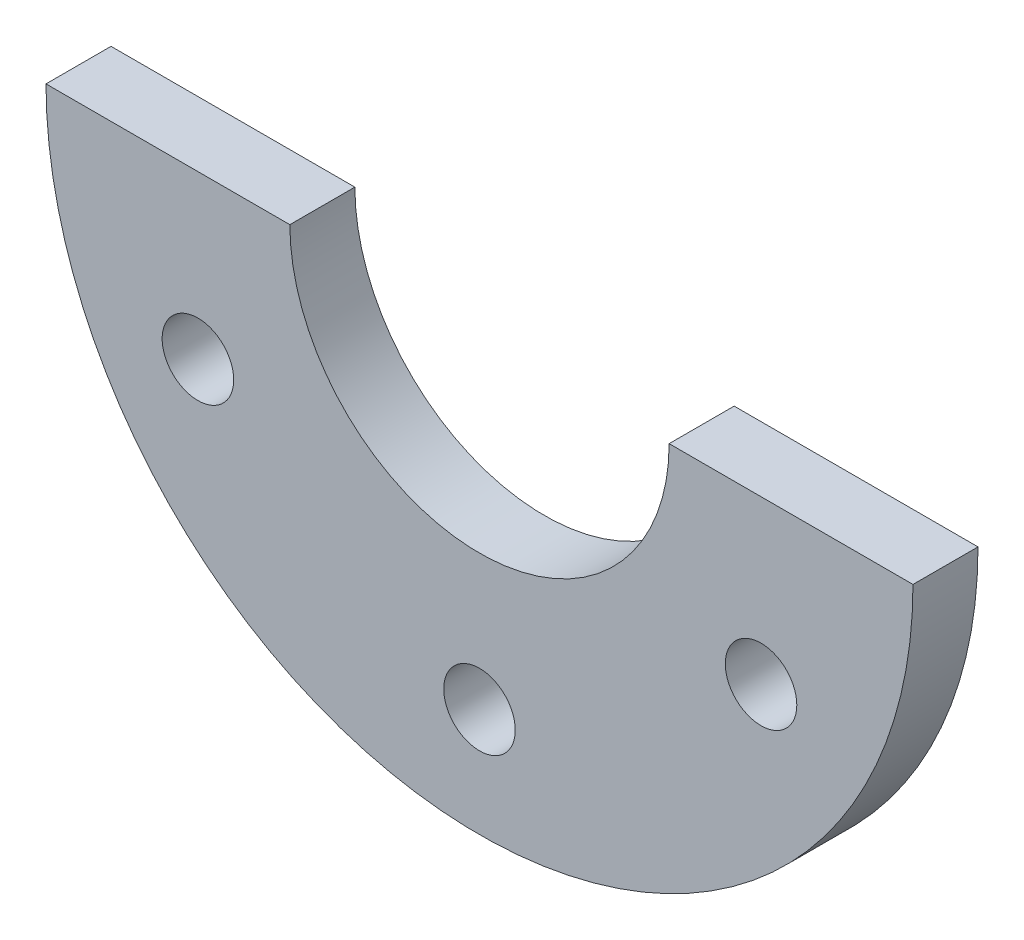
ISO-10303-21;
HEADER;
FILE_DESCRIPTION(('STEP AP214'),'2;1');
FILE_NAME('part.step','',(''),(''),'','','');
FILE_SCHEMA(('AUTOMOTIVE_DESIGN { 1 0 10303 214 1 1 1 1 }'));
ENDSEC;
DATA;
#1=APPLICATION_CONTEXT('core data for automotive mechanical design processes');
#2=APPLICATION_PROTOCOL_DEFINITION('international standard','automotive_design',2000,#1);
#3=PRODUCT_CONTEXT('',#1,'mechanical');
#4=PRODUCT('Part','Part','',(#3));
#5=PRODUCT_RELATED_PRODUCT_CATEGORY('part','',(#4));
#6=PRODUCT_DEFINITION_FORMATION('','',#4);
#7=PRODUCT_DEFINITION_CONTEXT('part definition',#1,'design');
#8=PRODUCT_DEFINITION('design','',#6,#7);
#9=PRODUCT_DEFINITION_SHAPE('','',#8);
#10=(LENGTH_UNIT() NAMED_UNIT(*) SI_UNIT(.MILLI.,.METRE.));
#11=(NAMED_UNIT(*) PLANE_ANGLE_UNIT() SI_UNIT($,.RADIAN.));
#12=(NAMED_UNIT(*) SI_UNIT($,.STERADIAN.) SOLID_ANGLE_UNIT());
#13=UNCERTAINTY_MEASURE_WITH_UNIT(LENGTH_MEASURE(1.E-05),#10,'distance_accuracy_value','');
#14=(GEOMETRIC_REPRESENTATION_CONTEXT(3) GLOBAL_UNCERTAINTY_ASSIGNED_CONTEXT((#13)) GLOBAL_UNIT_ASSIGNED_CONTEXT((#10,
#11,#12)) REPRESENTATION_CONTEXT('',''));
#15=CARTESIAN_POINT('',(0.,0.,0.));
#16=DIRECTION('',(0.,0.,1.));
#17=DIRECTION('',(1.,0.,0.));
#18=AXIS2_PLACEMENT_3D('',#15,#16,#17);
#19=CARTESIAN_POINT('',(0.,0.,6.));
#20=DIRECTION('',(0.,0.,-1.));
#21=DIRECTION('',(-1.,0.,0.));
#22=AXIS2_PLACEMENT_3D('',#19,#20,#21);
#23=CYLINDRICAL_SURFACE('',#22,40.);
#24=CARTESIAN_POINT('',(0.,0.,0.));
#25=DIRECTION('',(0.,0.,1.));
#26=DIRECTION('',(1.,0.,0.));
#27=AXIS2_PLACEMENT_3D('',#24,#25,#26);
#28=CIRCLE('',#27,40.);
#29=CARTESIAN_POINT('',(-40.,0.,0.));
#30=VERTEX_POINT('',#29);
#31=CARTESIAN_POINT('',(40.,0.,0.));
#32=VERTEX_POINT('',#31);
#33=EDGE_CURVE('E96',#30,#32,#28,.T.);
#34=ORIENTED_EDGE('',*,*,#33,.T.);
#35=DIRECTION('',(0.,0.,-1.));
#36=VECTOR('',#35,1.);
#37=CARTESIAN_POINT('',(40.,0.,6.));
#38=LINE('',#37,#36);
#39=CARTESIAN_POINT('',(40.,0.,6.));
#40=VERTEX_POINT('',#39);
#41=EDGE_CURVE('E11',#40,#32,#38,.T.);
#42=ORIENTED_EDGE('',*,*,#41,.F.);
#43=CARTESIAN_POINT('',(0.,0.,6.));
#44=DIRECTION('',(0.,0.,1.));
#45=DIRECTION('',(1.,0.,0.));
#46=AXIS2_PLACEMENT_3D('',#43,#44,#45);
#47=CIRCLE('',#46,40.);
#48=CARTESIAN_POINT('',(-40.,0.,6.));
#49=VERTEX_POINT('',#48);
#50=EDGE_CURVE('E84',#49,#40,#47,.T.);
#51=ORIENTED_EDGE('',*,*,#50,.F.);
#52=DIRECTION('',(0.,0.,-1.));
#53=VECTOR('',#52,1.);
#54=CARTESIAN_POINT('',(-40.,0.,6.));
#55=LINE('',#54,#53);
#56=EDGE_CURVE('E92',#49,#30,#55,.T.);
#57=ORIENTED_EDGE('',*,*,#56,.T.);
#58=EDGE_LOOP('',(#34,#42,#51,#57));
#59=FACE_BOUND('',#58,.T.);
#60=ADVANCED_FACE('F33',(#59),#23,.T.);
#61=CARTESIAN_POINT('',(17.5,0.,6.));
#62=DIRECTION('',(0.,-1.,0.));
#63=DIRECTION('',(1.,0.,0.));
#64=AXIS2_PLACEMENT_3D('',#61,#62,#63);
#65=PLANE('',#64);
#66=DIRECTION('',(-1.,0.,0.));
#67=VECTOR('',#66,1.);
#68=CARTESIAN_POINT('',(17.5,0.,0.));
#69=LINE('',#68,#67);
#70=CARTESIAN_POINT('',(17.5,0.,0.));
#71=VERTEX_POINT('',#70);
#72=EDGE_CURVE('E88',#32,#71,#69,.T.);
#73=ORIENTED_EDGE('',*,*,#72,.T.);
#74=DIRECTION('',(0.,0.,-1.));
#75=VECTOR('',#74,1.);
#76=CARTESIAN_POINT('',(17.5,0.,6.));
#77=LINE('',#76,#75);
#78=CARTESIAN_POINT('',(17.5,0.,6.));
#79=VERTEX_POINT('',#78);
#80=EDGE_CURVE('E41',#79,#71,#77,.T.);
#81=ORIENTED_EDGE('',*,*,#80,.F.);
#82=DIRECTION('',(-1.,0.,0.));
#83=VECTOR('',#82,1.);
#84=CARTESIAN_POINT('',(17.5,0.,6.));
#85=LINE('',#84,#83);
#86=EDGE_CURVE('E79',#40,#79,#85,.T.);
#87=ORIENTED_EDGE('',*,*,#86,.F.);
#88=ORIENTED_EDGE('',*,*,#41,.T.);
#89=EDGE_LOOP('',(#73,#81,#87,#88));
#90=FACE_BOUND('',#89,.T.);
#91=ADVANCED_FACE('F87',(#90),#65,.F.);
#92=CARTESIAN_POINT('',(0.,0.,6.));
#93=DIRECTION('',(0.,0.,-1.));
#94=DIRECTION('',(-1.,0.,0.));
#95=AXIS2_PLACEMENT_3D('',#92,#93,#94);
#96=CYLINDRICAL_SURFACE('',#95,17.5);
#97=CARTESIAN_POINT('',(0.,0.,0.));
#98=DIRECTION('',(0.,0.,-1.));
#99=DIRECTION('',(1.,0.,0.));
#100=AXIS2_PLACEMENT_3D('',#97,#98,#99);
#101=CIRCLE('',#100,17.5);
#102=CARTESIAN_POINT('',(-17.5,0.,0.));
#103=VERTEX_POINT('',#102);
#104=EDGE_CURVE('E66',#71,#103,#101,.T.);
#105=ORIENTED_EDGE('',*,*,#104,.T.);
#106=DIRECTION('',(0.,0.,-1.));
#107=VECTOR('',#106,1.);
#108=CARTESIAN_POINT('',(-17.5,0.,6.));
#109=LINE('',#108,#107);
#110=CARTESIAN_POINT('',(-17.5,0.,6.));
#111=VERTEX_POINT('',#110);
#112=EDGE_CURVE('E89',#111,#103,#109,.T.);
#113=ORIENTED_EDGE('',*,*,#112,.F.);
#114=CARTESIAN_POINT('',(0.,0.,6.));
#115=DIRECTION('',(0.,0.,-1.));
#116=DIRECTION('',(1.,0.,0.));
#117=AXIS2_PLACEMENT_3D('',#114,#115,#116);
#118=CIRCLE('',#117,17.5);
#119=EDGE_CURVE('E82',#79,#111,#118,.T.);
#120=ORIENTED_EDGE('',*,*,#119,.F.);
#121=ORIENTED_EDGE('',*,*,#80,.T.);
#122=EDGE_LOOP('',(#105,#113,#120,#121));
#123=FACE_BOUND('',#122,.T.);
#124=ADVANCED_FACE('F90',(#123),#96,.F.);
#125=CARTESIAN_POINT('',(-40.,0.,6.));
#126=DIRECTION('',(0.,-1.,0.));
#127=DIRECTION('',(1.,0.,0.));
#128=AXIS2_PLACEMENT_3D('',#125,#126,#127);
#129=PLANE('',#128);
#130=DIRECTION('',(-1.,0.,0.));
#131=VECTOR('',#130,1.);
#132=CARTESIAN_POINT('',(-40.,0.,0.));
#133=LINE('',#132,#131);
#134=EDGE_CURVE('E72',#103,#30,#133,.T.);
#135=ORIENTED_EDGE('',*,*,#134,.T.);
#136=ORIENTED_EDGE('',*,*,#56,.F.);
#137=DIRECTION('',(-1.,0.,0.));
#138=VECTOR('',#137,1.);
#139=CARTESIAN_POINT('',(-40.,0.,6.));
#140=LINE('',#139,#138);
#141=EDGE_CURVE('E49',#111,#49,#140,.T.);
#142=ORIENTED_EDGE('',*,*,#141,.F.);
#143=ORIENTED_EDGE('',*,*,#112,.T.);
#144=EDGE_LOOP('',(#135,#136,#142,#143));
#145=FACE_BOUND('',#144,.T.);
#146=ADVANCED_FACE('F104',(#145),#129,.F.);
#147=CARTESIAN_POINT('',(0.,0.,6.));
#148=DIRECTION('',(0.,0.,1.));
#149=DIRECTION('',(1.,0.,0.));
#150=AXIS2_PLACEMENT_3D('',#147,#148,#149);
#151=PLANE('',#150);
#152=CARTESIAN_POINT('',(0.,-30.,6.));
#153=DIRECTION('',(0.,0.,1.));
#154=DIRECTION('',(1.,0.,0.));
#155=AXIS2_PLACEMENT_3D('',#152,#153,#154);
#156=CIRCLE('',#155,3.3);
#157=CARTESIAN_POINT('',(3.3,-30.,6.));
#158=VERTEX_POINT('',#157);
#159=EDGE_CURVE('E99',#158,#158,#156,.T.);
#160=ORIENTED_EDGE('',*,*,#159,.F.);
#161=EDGE_LOOP('',(#160));
#162=FACE_BOUND('',#161,.T.);
#163=CARTESIAN_POINT('',(-25.9807621135332,-14.9999999999999,6.));
#164=DIRECTION('',(0.,0.,1.));
#165=DIRECTION('',(1.,0.,0.));
#166=AXIS2_PLACEMENT_3D('',#163,#164,#165);
#167=CIRCLE('',#166,3.3);
#168=CARTESIAN_POINT('',(-22.6807621135332,-14.9999999999999,6.));
#169=VERTEX_POINT('',#168);
#170=EDGE_CURVE('E119',#169,#169,#167,.T.);
#171=ORIENTED_EDGE('',*,*,#170,.F.);
#172=EDGE_LOOP('',(#171));
#173=FACE_BOUND('',#172,.T.);
#174=CARTESIAN_POINT('',(25.980762113533,-15.0000000000003,6.));
#175=DIRECTION('',(0.,0.,1.));
#176=DIRECTION('',(1.,0.,0.));
#177=AXIS2_PLACEMENT_3D('',#174,#175,#176);
#178=CIRCLE('',#177,3.3);
#179=CARTESIAN_POINT('',(29.280762113533,-15.0000000000003,6.));
#180=VERTEX_POINT('',#179);
#181=EDGE_CURVE('E113',#180,#180,#178,.T.);
#182=ORIENTED_EDGE('',*,*,#181,.F.);
#183=EDGE_LOOP('',(#182));
#184=FACE_BOUND('',#183,.T.);
#185=ORIENTED_EDGE('',*,*,#50,.T.);
#186=ORIENTED_EDGE('',*,*,#86,.T.);
#187=ORIENTED_EDGE('',*,*,#119,.T.);
#188=ORIENTED_EDGE('',*,*,#141,.T.);
#189=EDGE_LOOP('',(#185,#186,#187,#188));
#190=FACE_BOUND('',#189,.T.);
#191=ADVANCED_FACE('F80',(#162,#173,#184,#190),#151,.T.);
#192=CARTESIAN_POINT('',(0.,0.,0.));
#193=DIRECTION('',(0.,0.,1.));
#194=DIRECTION('',(1.,0.,0.));
#195=AXIS2_PLACEMENT_3D('',#192,#193,#194);
#196=PLANE('',#195);
#197=CARTESIAN_POINT('',(0.,-30.,0.));
#198=DIRECTION('',(0.,0.,1.));
#199=DIRECTION('',(1.,0.,0.));
#200=AXIS2_PLACEMENT_3D('',#197,#198,#199);
#201=CIRCLE('',#200,3.3);
#202=CARTESIAN_POINT('',(3.3,-30.,0.));
#203=VERTEX_POINT('',#202);
#204=EDGE_CURVE('E122',#203,#203,#201,.T.);
#205=ORIENTED_EDGE('',*,*,#204,.T.);
#206=EDGE_LOOP('',(#205));
#207=FACE_BOUND('',#206,.T.);
#208=CARTESIAN_POINT('',(-25.9807621135332,-14.9999999999999,0.));
#209=DIRECTION('',(0.,0.,1.));
#210=DIRECTION('',(1.,0.,0.));
#211=AXIS2_PLACEMENT_3D('',#208,#209,#210);
#212=CIRCLE('',#211,3.3);
#213=CARTESIAN_POINT('',(-22.6807621135332,-14.9999999999999,0.));
#214=VERTEX_POINT('',#213);
#215=EDGE_CURVE('E116',#214,#214,#212,.T.);
#216=ORIENTED_EDGE('',*,*,#215,.T.);
#217=EDGE_LOOP('',(#216));
#218=FACE_BOUND('',#217,.T.);
#219=CARTESIAN_POINT('',(25.980762113533,-15.0000000000003,0.));
#220=DIRECTION('',(0.,0.,1.));
#221=DIRECTION('',(1.,0.,0.));
#222=AXIS2_PLACEMENT_3D('',#219,#220,#221);
#223=CIRCLE('',#222,3.3);
#224=CARTESIAN_POINT('',(29.280762113533,-15.0000000000003,0.));
#225=VERTEX_POINT('',#224);
#226=EDGE_CURVE('E110',#225,#225,#223,.T.);
#227=ORIENTED_EDGE('',*,*,#226,.T.);
#228=EDGE_LOOP('',(#227));
#229=FACE_BOUND('',#228,.T.);
#230=ORIENTED_EDGE('',*,*,#33,.F.);
#231=ORIENTED_EDGE('',*,*,#134,.F.);
#232=ORIENTED_EDGE('',*,*,#104,.F.);
#233=ORIENTED_EDGE('',*,*,#72,.F.);
#234=EDGE_LOOP('',(#230,#231,#232,#233));
#235=FACE_BOUND('',#234,.T.);
#236=ADVANCED_FACE('F107',(#207,#218,#229,#235),#196,.F.);
#237=CARTESIAN_POINT('',(25.980762113533,-15.0000000000003,6.));
#238=DIRECTION('',(0.,0.,-1.));
#239=DIRECTION('',(-1.,0.,0.));
#240=AXIS2_PLACEMENT_3D('',#237,#238,#239);
#241=CYLINDRICAL_SURFACE('',#240,3.3);
#242=ORIENTED_EDGE('',*,*,#181,.T.);
#243=EDGE_LOOP('',(#242));
#244=FACE_BOUND('',#243,.T.);
#245=ORIENTED_EDGE('',*,*,#226,.F.);
#246=EDGE_LOOP('',(#245));
#247=FACE_BOUND('',#246,.T.);
#248=ADVANCED_FACE('F138',(#244,#247),#241,.F.);
#249=CARTESIAN_POINT('',(-25.9807621135332,-14.9999999999999,6.));
#250=DIRECTION('',(0.,0.,-1.));
#251=DIRECTION('',(-1.,0.,0.));
#252=AXIS2_PLACEMENT_3D('',#249,#250,#251);
#253=CYLINDRICAL_SURFACE('',#252,3.3);
#254=ORIENTED_EDGE('',*,*,#170,.T.);
#255=EDGE_LOOP('',(#254));
#256=FACE_BOUND('',#255,.T.);
#257=ORIENTED_EDGE('',*,*,#215,.F.);
#258=EDGE_LOOP('',(#257));
#259=FACE_BOUND('',#258,.T.);
#260=ADVANCED_FACE('F141',(#256,#259),#253,.F.);
#261=CARTESIAN_POINT('',(0.,-30.,6.));
#262=DIRECTION('',(0.,0.,-1.));
#263=DIRECTION('',(-1.,0.,0.));
#264=AXIS2_PLACEMENT_3D('',#261,#262,#263);
#265=CYLINDRICAL_SURFACE('',#264,3.3);
#266=ORIENTED_EDGE('',*,*,#159,.T.);
#267=EDGE_LOOP('',(#266));
#268=FACE_BOUND('',#267,.T.);
#269=ORIENTED_EDGE('',*,*,#204,.F.);
#270=EDGE_LOOP('',(#269));
#271=FACE_BOUND('',#270,.T.);
#272=ADVANCED_FACE('F128',(#268,#271),#265,.F.);
#273=CLOSED_SHELL('',(#60,#91,#124,#146,#191,#236,#248,#260,#272));
#274=MANIFOLD_SOLID_BREP('B2',#273);
#275=ADVANCED_BREP_SHAPE_REPRESENTATION('',(#18,#274),#14);
#276=SHAPE_DEFINITION_REPRESENTATION(#9,#275);
ENDSEC;
END-ISO-10303-21;
